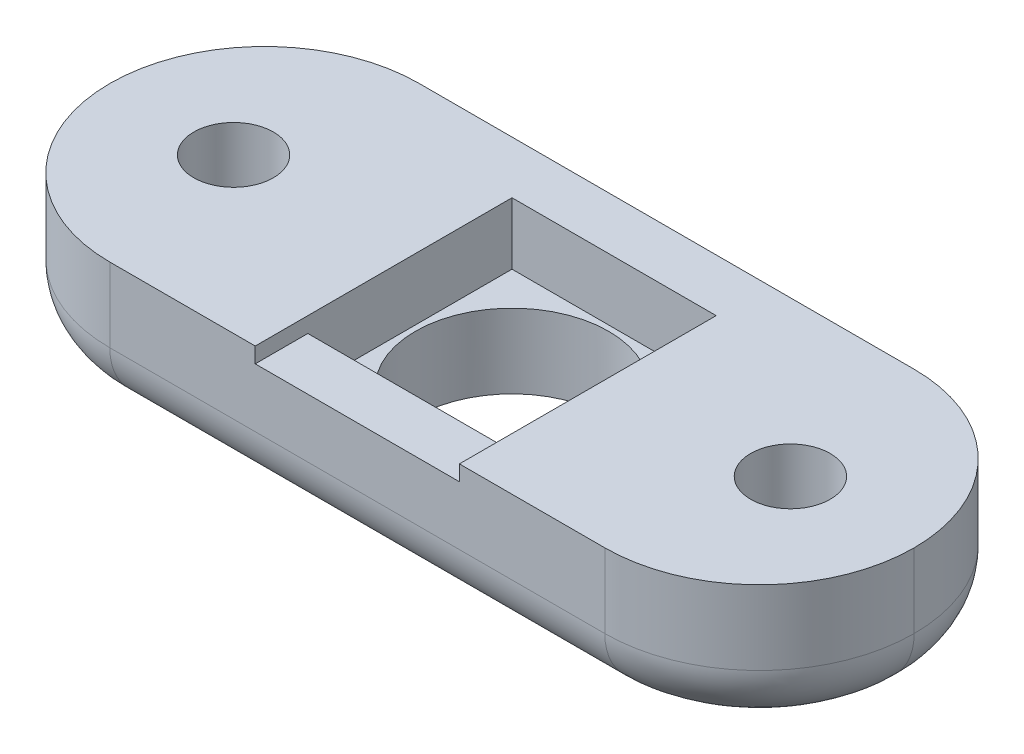
ISO-10303-21;
HEADER;
FILE_DESCRIPTION(('STEP AP214'),'2;1');
FILE_NAME('part.step','',(''),(''),'','','');
FILE_SCHEMA(('AUTOMOTIVE_DESIGN { 1 0 10303 214 1 1 1 1 }'));
ENDSEC;
DATA;
#1=APPLICATION_CONTEXT('core data for automotive mechanical design processes');
#2=APPLICATION_PROTOCOL_DEFINITION('international standard','automotive_design',2000,#1);
#3=PRODUCT_CONTEXT('',#1,'mechanical');
#4=PRODUCT('Part','Part','',(#3));
#5=PRODUCT_RELATED_PRODUCT_CATEGORY('part','',(#4));
#6=PRODUCT_DEFINITION_FORMATION('','',#4);
#7=PRODUCT_DEFINITION_CONTEXT('part definition',#1,'design');
#8=PRODUCT_DEFINITION('design','',#6,#7);
#9=PRODUCT_DEFINITION_SHAPE('','',#8);
#10=(LENGTH_UNIT() NAMED_UNIT(*) SI_UNIT(.MILLI.,.METRE.));
#11=(NAMED_UNIT(*) PLANE_ANGLE_UNIT() SI_UNIT($,.RADIAN.));
#12=(NAMED_UNIT(*) SI_UNIT($,.STERADIAN.) SOLID_ANGLE_UNIT());
#13=UNCERTAINTY_MEASURE_WITH_UNIT(LENGTH_MEASURE(1.E-05),#10,'distance_accuracy_value','');
#14=(GEOMETRIC_REPRESENTATION_CONTEXT(3) GLOBAL_UNCERTAINTY_ASSIGNED_CONTEXT((#13)) GLOBAL_UNIT_ASSIGNED_CONTEXT((#10,
#11,#12)) REPRESENTATION_CONTEXT('',''));
#15=CARTESIAN_POINT('',(0.,0.,0.));
#16=DIRECTION('',(0.,0.,1.));
#17=DIRECTION('',(1.,0.,0.));
#18=AXIS2_PLACEMENT_3D('',#15,#16,#17);
#19=CARTESIAN_POINT('',(0.,0.,0.));
#20=DIRECTION('',(0.,-1.,0.));
#21=DIRECTION('',(0.,0.,-1.));
#22=AXIS2_PLACEMENT_3D('',#19,#20,#21);
#23=PLANE('',#22);
#24=CARTESIAN_POINT('',(-5.18594813304628,0.,-4.34912879852682));
#25=DIRECTION('',(0.,-1.,0.));
#26=DIRECTION('',(0.,0.,-1.));
#27=AXIS2_PLACEMENT_3D('',#24,#25,#26);
#28=CIRCLE('',#27,3.81);
#29=CARTESIAN_POINT('',(-1.37594813304627,0.,-4.34912879852681));
#30=VERTEX_POINT('',#29);
#31=CARTESIAN_POINT('',(-5.18594813304627,0.,-0.53912879852682));
#32=VERTEX_POINT('',#31);
#33=EDGE_CURVE('E250',#30,#32,#28,.T.);
#34=ORIENTED_EDGE('',*,*,#33,.T.);
#35=DIRECTION('',(1.,0.,0.));
#36=VECTOR('',#35,1.);
#37=CARTESIAN_POINT('',(-25.5059481330463,0.,-0.539128798526818));
#38=LINE('',#37,#36);
#39=CARTESIAN_POINT('',(-14.2346981330463,0.,-0.539128798526819));
#40=VERTEX_POINT('',#39);
#41=EDGE_CURVE('E252',#32,#40,#38,.F.);
#42=ORIENTED_EDGE('',*,*,#41,.T.);
#43=CARTESIAN_POINT('',(-15.3459481330463,0.,-4.34912879852682));
#44=DIRECTION('',(0.,1.,0.));
#45=DIRECTION('',(0.,0.,1.));
#46=AXIS2_PLACEMENT_3D('',#43,#44,#45);
#47=CIRCLE('',#46,3.96875);
#48=CARTESIAN_POINT('',(-14.2346981330463,0.,-8.15912879852682));
#49=VERTEX_POINT('',#48);
#50=EDGE_CURVE('E189',#40,#49,#47,.T.);
#51=ORIENTED_EDGE('',*,*,#50,.T.);
#52=DIRECTION('',(-1.,0.,0.));
#53=VECTOR('',#52,1.);
#54=CARTESIAN_POINT('',(-5.18594813304627,0.,-8.15912879852682));
#55=LINE('',#54,#53);
#56=CARTESIAN_POINT('',(-5.18594813304627,0.,-8.15912879852682));
#57=VERTEX_POINT('',#56);
#58=EDGE_CURVE('E246',#49,#57,#55,.F.);
#59=ORIENTED_EDGE('',*,*,#58,.T.);
#60=CARTESIAN_POINT('',(-5.18594813304627,0.,-4.34912879852682));
#61=DIRECTION('',(0.,-1.,0.));
#62=DIRECTION('',(0.,0.,-1.));
#63=AXIS2_PLACEMENT_3D('',#60,#61,#62);
#64=CIRCLE('',#63,3.81);
#65=EDGE_CURVE('E248',#57,#30,#64,.T.);
#66=ORIENTED_EDGE('',*,*,#65,.T.);
#67=CARTESIAN_POINT('',(-3.91594813304627,0.,-4.34912879852681));
#68=DIRECTION('',(0.,-1.,0.));
#69=DIRECTION('',(0.,0.,-1.));
#70=AXIS2_PLACEMENT_3D('',#67,#68,#69);
#71=CIRCLE('',#70,2.54);
#72=EDGE_CURVE('E236',#30,#30,#71,.T.);
#73=ORIENTED_EDGE('',*,*,#72,.F.);
#74=EDGE_LOOP('',(#34,#42,#51,#59,#66,#73));
#75=FACE_BOUND('',#74,.T.);
#76=ADVANCED_FACE('F34',(#75),#23,.T.);
#77=CARTESIAN_POINT('',(-26.7759481330463,0.,-4.34912879852682));
#78=DIRECTION('',(0.,-1.,0.));
#79=DIRECTION('',(0.,0.,-1.));
#80=AXIS2_PLACEMENT_3D('',#77,#78,#79);
#81=CYLINDRICAL_SURFACE('',#80,1.63195);
#82=CARTESIAN_POINT('',(-26.7759481330463,5.588,-4.34912879852682));
#83=DIRECTION('',(0.,-1.,0.));
#84=DIRECTION('',(0.,0.,-1.));
#85=AXIS2_PLACEMENT_3D('',#82,#83,#84);
#86=CIRCLE('',#85,1.63195);
#87=CARTESIAN_POINT('',(-26.7759481330463,5.588,-5.98107879852681));
#88=VERTEX_POINT('',#87);
#89=EDGE_CURVE('E358',#88,#88,#86,.T.);
#90=ORIENTED_EDGE('',*,*,#89,.F.);
#91=EDGE_LOOP('',(#90));
#92=FACE_BOUND('',#91,.T.);
#93=CARTESIAN_POINT('',(-26.7759481330463,3.175,-4.34912879852682));
#94=DIRECTION('',(0.,-1.,0.));
#95=DIRECTION('',(0.,0.,-1.));
#96=AXIS2_PLACEMENT_3D('',#93,#94,#95);
#97=CIRCLE('',#96,1.63195);
#98=CARTESIAN_POINT('',(-26.7759481330463,3.175,-5.98107879852681));
#99=VERTEX_POINT('',#98);
#100=EDGE_CURVE('E233',#99,#99,#97,.F.);
#101=ORIENTED_EDGE('',*,*,#100,.F.);
#102=EDGE_LOOP('',(#101));
#103=FACE_BOUND('',#102,.T.);
#104=ADVANCED_FACE('F293',(#92,#103),#81,.F.);
#105=CARTESIAN_POINT('',(-3.91594813304627,0.,-4.34912879852681));
#106=DIRECTION('',(0.,-1.,0.));
#107=DIRECTION('',(0.,0.,-1.));
#108=AXIS2_PLACEMENT_3D('',#105,#106,#107);
#109=CYLINDRICAL_SURFACE('',#108,1.63195);
#110=CARTESIAN_POINT('',(-3.91594813304627,5.588,-4.34912879852681));
#111=DIRECTION('',(0.,-1.,0.));
#112=DIRECTION('',(0.,0.,-1.));
#113=AXIS2_PLACEMENT_3D('',#110,#111,#112);
#114=CIRCLE('',#113,1.63195);
#115=CARTESIAN_POINT('',(-3.91594813304627,5.588,-5.98107879852681));
#116=VERTEX_POINT('',#115);
#117=EDGE_CURVE('E225',#116,#116,#114,.T.);
#118=ORIENTED_EDGE('',*,*,#117,.F.);
#119=EDGE_LOOP('',(#118));
#120=FACE_BOUND('',#119,.T.);
#121=CARTESIAN_POINT('',(-3.91594813304627,3.175,-4.34912879852681));
#122=DIRECTION('',(0.,-1.,0.));
#123=DIRECTION('',(0.,0.,-1.));
#124=AXIS2_PLACEMENT_3D('',#121,#122,#123);
#125=CIRCLE('',#124,1.63195);
#126=CARTESIAN_POINT('',(-3.91594813304627,3.175,-5.98107879852681));
#127=VERTEX_POINT('',#126);
#128=EDGE_CURVE('E229',#127,#127,#125,.F.);
#129=ORIENTED_EDGE('',*,*,#128,.F.);
#130=EDGE_LOOP('',(#129));
#131=FACE_BOUND('',#130,.T.);
#132=ADVANCED_FACE('F300',(#120,#131),#109,.F.);
#133=CARTESIAN_POINT('',(0.,5.588,0.));
#134=DIRECTION('',(0.,-1.,0.));
#135=DIRECTION('',(0.,0.,-1.));
#136=AXIS2_PLACEMENT_3D('',#133,#134,#135);
#137=PLANE('',#136);
#138=ORIENTED_EDGE('',*,*,#117,.T.);
#139=EDGE_LOOP('',(#138));
#140=FACE_BOUND('',#139,.T.);
#141=ORIENTED_EDGE('',*,*,#89,.T.);
#142=EDGE_LOOP('',(#141));
#143=FACE_BOUND('',#142,.T.);
#144=DIRECTION('',(0.,0.,-1.));
#145=VECTOR('',#144,1.);
#146=CARTESIAN_POINT('',(-11.1549481330463,5.588,-8.54012879852682));
#147=LINE('',#146,#145);
#148=CARTESIAN_POINT('',(-11.1549481330463,5.588,2.00087120147318));
#149=VERTEX_POINT('',#148);
#150=CARTESIAN_POINT('',(-11.1549481330463,5.588,-8.54012879852682));
#151=VERTEX_POINT('',#150);
#152=EDGE_CURVE('E369',#149,#151,#147,.T.);
#153=ORIENTED_EDGE('',*,*,#152,.F.);
#154=DIRECTION('',(1.,0.,0.));
#155=VECTOR('',#154,1.);
#156=CARTESIAN_POINT('',(1.16405186695372,5.588,2.00087120147318));
#157=LINE('',#156,#155);
#158=CARTESIAN_POINT('',(-5.18594813304627,5.588,2.00087120147318));
#159=VERTEX_POINT('',#158);
#160=EDGE_CURVE('E192',#149,#159,#157,.T.);
#161=ORIENTED_EDGE('',*,*,#160,.T.);
#162=CARTESIAN_POINT('',(-5.18594813304628,5.588,-4.34912879852682));
#163=DIRECTION('',(0.,-1.,0.));
#164=DIRECTION('',(0.,0.,-1.));
#165=AXIS2_PLACEMENT_3D('',#162,#163,#164);
#166=CIRCLE('',#165,6.35);
#167=CARTESIAN_POINT('',(1.16405186695372,5.588,-4.34912879852682));
#168=VERTEX_POINT('',#167);
#169=EDGE_CURVE('E209',#159,#168,#166,.F.);
#170=ORIENTED_EDGE('',*,*,#169,.T.);
#171=CARTESIAN_POINT('',(-5.18594813304627,5.588,-4.34912879852682));
#172=DIRECTION('',(0.,-1.,0.));
#173=DIRECTION('',(0.,0.,-1.));
#174=AXIS2_PLACEMENT_3D('',#171,#172,#173);
#175=CIRCLE('',#174,6.35);
#176=CARTESIAN_POINT('',(-5.18594813304627,5.588,-10.6991287985268));
#177=VERTEX_POINT('',#176);
#178=EDGE_CURVE('E211',#168,#177,#175,.F.);
#179=ORIENTED_EDGE('',*,*,#178,.T.);
#180=DIRECTION('',(-1.,0.,0.));
#181=VECTOR('',#180,1.);
#182=CARTESIAN_POINT('',(1.16405186695372,5.588,-10.6991287985268));
#183=LINE('',#182,#181);
#184=CARTESIAN_POINT('',(-25.5059481330463,5.588,-10.6991287985268));
#185=VERTEX_POINT('',#184);
#186=EDGE_CURVE('E197',#177,#185,#183,.T.);
#187=ORIENTED_EDGE('',*,*,#186,.T.);
#188=CARTESIAN_POINT('',(-25.5059481330463,5.588,-4.34912879852682));
#189=DIRECTION('',(0.,-1.,0.));
#190=DIRECTION('',(0.,0.,-1.));
#191=AXIS2_PLACEMENT_3D('',#188,#189,#190);
#192=CIRCLE('',#191,6.35);
#193=CARTESIAN_POINT('',(-31.8559481330463,5.588,-4.34912879852682));
#194=VERTEX_POINT('',#193);
#195=EDGE_CURVE('E213',#185,#194,#192,.F.);
#196=ORIENTED_EDGE('',*,*,#195,.T.);
#197=CARTESIAN_POINT('',(-25.5059481330463,5.588,-4.34912879852682));
#198=DIRECTION('',(0.,-1.,0.));
#199=DIRECTION('',(0.,0.,-1.));
#200=AXIS2_PLACEMENT_3D('',#197,#198,#199);
#201=CIRCLE('',#200,6.35);
#202=CARTESIAN_POINT('',(-25.5059481330463,5.588,2.00087120147318));
#203=VERTEX_POINT('',#202);
#204=EDGE_CURVE('E215',#194,#203,#201,.F.);
#205=ORIENTED_EDGE('',*,*,#204,.T.);
#206=CARTESIAN_POINT('',(-19.5369481330463,5.588,2.00087120147318));
#207=VERTEX_POINT('',#206);
#208=EDGE_CURVE('E194',#203,#207,#157,.T.);
#209=ORIENTED_EDGE('',*,*,#208,.T.);
#210=DIRECTION('',(0.,0.,1.));
#211=VECTOR('',#210,1.);
#212=CARTESIAN_POINT('',(-19.5369481330463,5.588,-8.54012879852682));
#213=LINE('',#212,#211);
#214=CARTESIAN_POINT('',(-19.5369481330463,5.588,-8.54012879852682));
#215=VERTEX_POINT('',#214);
#216=EDGE_CURVE('E361',#215,#207,#213,.T.);
#217=ORIENTED_EDGE('',*,*,#216,.F.);
#218=DIRECTION('',(-1.,0.,0.));
#219=VECTOR('',#218,1.);
#220=CARTESIAN_POINT('',(-11.1549481330463,5.588,-8.54012879852682));
#221=LINE('',#220,#219);
#222=EDGE_CURVE('E364',#151,#215,#221,.T.);
#223=ORIENTED_EDGE('',*,*,#222,.F.);
#224=EDGE_LOOP('',(#153,#161,#170,#179,#187,#196,#205,#209,#217,#223));
#225=FACE_BOUND('',#224,.T.);
#226=ADVANCED_FACE('F306',(#140,#143,#225),#137,.F.);
#227=CARTESIAN_POINT('',(-16.4571981330463,0.,-8.15912879852682));
#228=VERTEX_POINT('',#227);
#229=CARTESIAN_POINT('',(-16.4571981330463,0.,-0.539128798526819));
#230=VERTEX_POINT('',#229);
#231=EDGE_CURVE('E193',#228,#230,#47,.T.);
#232=ORIENTED_EDGE('',*,*,#231,.T.);
#233=DIRECTION('',(1.,0.,0.));
#234=VECTOR('',#233,1.);
#235=CARTESIAN_POINT('',(-25.5059481330463,0.,-0.539128798526818));
#236=LINE('',#235,#234);
#237=CARTESIAN_POINT('',(-25.5059481330463,0.,-0.539128798526817));
#238=VERTEX_POINT('',#237);
#239=EDGE_CURVE('E244',#230,#238,#236,.F.);
#240=ORIENTED_EDGE('',*,*,#239,.T.);
#241=CARTESIAN_POINT('',(-25.5059481330463,0.,-4.34912879852682));
#242=DIRECTION('',(0.,-1.,0.));
#243=DIRECTION('',(0.,0.,-1.));
#244=AXIS2_PLACEMENT_3D('',#241,#242,#243);
#245=CIRCLE('',#244,3.81);
#246=CARTESIAN_POINT('',(-29.3159481330463,0.,-4.34912879852682));
#247=VERTEX_POINT('',#246);
#248=EDGE_CURVE('E241',#238,#247,#245,.T.);
#249=ORIENTED_EDGE('',*,*,#248,.T.);
#250=CARTESIAN_POINT('',(-26.7759481330463,0.,-4.34912879852682));
#251=DIRECTION('',(0.,-1.,0.));
#252=DIRECTION('',(0.,0.,-1.));
#253=AXIS2_PLACEMENT_3D('',#250,#251,#252);
#254=CIRCLE('',#253,2.54);
#255=EDGE_CURVE('E340',#247,#247,#254,.T.);
#256=ORIENTED_EDGE('',*,*,#255,.F.);
#257=CARTESIAN_POINT('',(-25.5059481330463,0.,-4.34912879852682));
#258=DIRECTION('',(0.,-1.,0.));
#259=DIRECTION('',(0.,0.,-1.));
#260=AXIS2_PLACEMENT_3D('',#257,#258,#259);
#261=CIRCLE('',#260,3.81);
#262=CARTESIAN_POINT('',(-25.5059481330463,0.,-8.15912879852682));
#263=VERTEX_POINT('',#262);
#264=EDGE_CURVE('E221',#247,#263,#261,.T.);
#265=ORIENTED_EDGE('',*,*,#264,.T.);
#266=DIRECTION('',(-1.,0.,0.));
#267=VECTOR('',#266,1.);
#268=CARTESIAN_POINT('',(-5.18594813304627,0.,-8.15912879852682));
#269=LINE('',#268,#267);
#270=EDGE_CURVE('E239',#263,#228,#269,.F.);
#271=ORIENTED_EDGE('',*,*,#270,.T.);
#272=EDGE_LOOP('',(#232,#240,#249,#256,#265,#271));
#273=FACE_BOUND('',#272,.T.);
#274=ADVANCED_FACE('F296',(#273),#23,.T.);
#275=CARTESIAN_POINT('',(1.16405186695372,5.588,2.00087120147318));
#276=DIRECTION('',(0.,0.,-1.));
#277=DIRECTION('',(-1.,0.,0.));
#278=AXIS2_PLACEMENT_3D('',#275,#276,#277);
#279=PLANE('',#278);
#280=DIRECTION('',(0.,-1.,0.));
#281=VECTOR('',#280,1.);
#282=CARTESIAN_POINT('',(-25.5059481330463,5.588,2.00087120147318));
#283=LINE('',#282,#281);
#284=CARTESIAN_POINT('',(-25.5059481330463,2.54,2.00087120147318));
#285=VERTEX_POINT('',#284);
#286=EDGE_CURVE('E206',#203,#285,#283,.T.);
#287=ORIENTED_EDGE('',*,*,#286,.T.);
#288=DIRECTION('',(1.,0.,0.));
#289=VECTOR('',#288,1.);
#290=CARTESIAN_POINT('',(-5.18594813304627,2.54,2.00087120147318));
#291=LINE('',#290,#289);
#292=CARTESIAN_POINT('',(-5.18594813304627,2.54,2.00087120147318));
#293=VERTEX_POINT('',#292);
#294=EDGE_CURVE('E257',#285,#293,#291,.T.);
#295=ORIENTED_EDGE('',*,*,#294,.T.);
#296=DIRECTION('',(0.,-1.,0.));
#297=VECTOR('',#296,1.);
#298=CARTESIAN_POINT('',(-5.18594813304627,5.588,2.00087120147318));
#299=LINE('',#298,#297);
#300=EDGE_CURVE('E200',#293,#159,#299,.F.);
#301=ORIENTED_EDGE('',*,*,#300,.T.);
#302=ORIENTED_EDGE('',*,*,#160,.F.);
#303=DIRECTION('',(0.,1.,0.));
#304=VECTOR('',#303,1.);
#305=CARTESIAN_POINT('',(-11.1549481330463,4.953,2.00087120147318));
#306=LINE('',#305,#304);
#307=CARTESIAN_POINT('',(-11.1549481330463,4.953,2.00087120147318));
#308=VERTEX_POINT('',#307);
#309=EDGE_CURVE('E228',#308,#149,#306,.T.);
#310=ORIENTED_EDGE('',*,*,#309,.F.);
#311=DIRECTION('',(1.,0.,0.));
#312=VECTOR('',#311,1.);
#313=CARTESIAN_POINT('',(-11.1549481330463,4.953,2.00087120147318));
#314=LINE('',#313,#312);
#315=CARTESIAN_POINT('',(-19.5369481330463,4.953,2.00087120147318));
#316=VERTEX_POINT('',#315);
#317=EDGE_CURVE('E166',#316,#308,#314,.T.);
#318=ORIENTED_EDGE('',*,*,#317,.F.);
#319=DIRECTION('',(0.,1.,0.));
#320=VECTOR('',#319,1.);
#321=CARTESIAN_POINT('',(-19.5369481330463,4.953,2.00087120147318));
#322=LINE('',#321,#320);
#323=EDGE_CURVE('E162',#316,#207,#322,.T.);
#324=ORIENTED_EDGE('',*,*,#323,.T.);
#325=ORIENTED_EDGE('',*,*,#208,.F.);
#326=EDGE_LOOP('',(#287,#295,#301,#302,#310,#318,#324,#325));
#327=FACE_BOUND('',#326,.T.);
#328=ADVANCED_FACE('F305',(#327),#279,.F.);
#329=CARTESIAN_POINT('',(1.16405186695372,5.588,-10.6991287985268));
#330=DIRECTION('',(0.,0.,1.));
#331=DIRECTION('',(1.,0.,0.));
#332=AXIS2_PLACEMENT_3D('',#329,#330,#331);
#333=PLANE('',#332);
#334=DIRECTION('',(0.,-1.,0.));
#335=VECTOR('',#334,1.);
#336=CARTESIAN_POINT('',(-5.18594813304627,5.588,-10.6991287985268));
#337=LINE('',#336,#335);
#338=CARTESIAN_POINT('',(-5.18594813304627,2.54,-10.6991287985268));
#339=VERTEX_POINT('',#338);
#340=EDGE_CURVE('E217',#177,#339,#337,.T.);
#341=ORIENTED_EDGE('',*,*,#340,.T.);
#342=DIRECTION('',(-1.,0.,0.));
#343=VECTOR('',#342,1.);
#344=CARTESIAN_POINT('',(-25.5059481330463,2.54,-10.6991287985268));
#345=LINE('',#344,#343);
#346=CARTESIAN_POINT('',(-25.5059481330463,2.54,-10.6991287985268));
#347=VERTEX_POINT('',#346);
#348=EDGE_CURVE('E43',#339,#347,#345,.T.);
#349=ORIENTED_EDGE('',*,*,#348,.T.);
#350=DIRECTION('',(0.,-1.,0.));
#351=VECTOR('',#350,1.);
#352=CARTESIAN_POINT('',(-25.5059481330463,5.588,-10.6991287985268));
#353=LINE('',#352,#351);
#354=EDGE_CURVE('E219',#347,#185,#353,.F.);
#355=ORIENTED_EDGE('',*,*,#354,.T.);
#356=ORIENTED_EDGE('',*,*,#186,.F.);
#357=EDGE_LOOP('',(#341,#349,#355,#356));
#358=FACE_BOUND('',#357,.T.);
#359=ADVANCED_FACE('F312',(#358),#333,.F.);
#360=CARTESIAN_POINT('',(-15.3459481330463,5.588,-4.34912879852682));
#361=DIRECTION('',(0.,-1.,0.));
#362=DIRECTION('',(0.,0.,-1.));
#363=AXIS2_PLACEMENT_3D('',#360,#361,#362);
#364=CYLINDRICAL_SURFACE('',#363,3.96875);
#365=CARTESIAN_POINT('',(-15.3459481330463,3.048,-4.34912879852682));
#366=DIRECTION('',(0.,-1.,0.));
#367=DIRECTION('',(0.,0.,-1.));
#368=AXIS2_PLACEMENT_3D('',#365,#366,#367);
#369=CIRCLE('',#368,3.96875);
#370=CARTESIAN_POINT('',(-15.3459481330463,3.048,-8.31787879852682));
#371=VERTEX_POINT('',#370);
#372=EDGE_CURVE('E201',#371,#371,#369,.T.);
#373=ORIENTED_EDGE('',*,*,#372,.F.);
#374=EDGE_LOOP('',(#373));
#375=FACE_BOUND('',#374,.T.);
#376=ORIENTED_EDGE('',*,*,#50,.F.);
#377=CARTESIAN_POINT('',(-14.2346981330463,0.,-0.539128798526819));
#378=CARTESIAN_POINT('',(-14.3392931740389,4.60604915866399E-05,-0.508611398834149));
#379=CARTESIAN_POINT('',(-14.4451450763377,0.000551800659845645,-0.482422010887287));
#380=CARTESIAN_POINT('',(-14.6586563596952,0.00187512242722543,-0.438827096057001));
#381=CARTESIAN_POINT('',(-14.7663159888434,0.00269274716889175,-0.421422785174851));
#382=CARTESIAN_POINT('',(-14.9802680305637,0.00401687567847526,-0.395826187957534));
#383=CARTESIAN_POINT('',(-15.086536551412,0.00452997767245198,-0.38743507553609));
#384=CARTESIAN_POINT('',(-15.2993619638375,0.00503555180767513,-0.379222958807811));
#385=CARTESIAN_POINT('',(-15.4059187805202,0.00502814820242356,-0.379399909156143));
#386=CARTESIAN_POINT('',(-15.6707866582981,0.00433507158474852,-0.390521284922752));
#387=CARTESIAN_POINT('',(-15.8289209451164,0.00331943601041202,-0.406689627447391));
#388=CARTESIAN_POINT('',(-16.0650534718032,0.00170618632145947,-0.445234500049051));
#389=CARTESIAN_POINT('',(-16.1442591140336,0.00114829917393376,-0.460660163178343));
#390=CARTESIAN_POINT('',(-16.3015972686432,0.000299803684776872,-0.496310063060891));
#391=CARTESIAN_POINT('',(-16.3797296128841,9.23676046668937E-06,-0.516535042786955));
#392=CARTESIAN_POINT('',(-16.4571981330463,0.,-0.53912879852682));
#393=B_SPLINE_CURVE_WITH_KNOTS('',3,(#377,#378,#379,#380,#381,#382,#383,#384,#385,#386,#387,
#388,#389,#390,#391,#392),.UNSPECIFIED.,.F.,.F.,(4,2,2,2,2,2,2,4),(0.,0.326767419494472,
0.653580056658502,0.973025199141419,1.29239408491758,1.76796252161595,2.00992423099308,
2.25192342245369),.UNSPECIFIED.);
#394=EDGE_CURVE('E266',#40,#230,#393,.T.);
#395=ORIENTED_EDGE('',*,*,#394,.T.);
#396=ORIENTED_EDGE('',*,*,#231,.F.);
#397=CARTESIAN_POINT('',(-16.4571981330463,0.,-8.15912879852682));
#398=CARTESIAN_POINT('',(-16.3526030920537,4.60604915872649E-05,-8.18964619821949));
#399=CARTESIAN_POINT('',(-16.2467511897548,0.000551800659846458,-8.21583558616635));
#400=CARTESIAN_POINT('',(-16.0332399063974,0.00187512242722614,-8.25943050099663));
#401=CARTESIAN_POINT('',(-15.9255802772491,0.00269274716889215,-8.27683481187879));
#402=CARTESIAN_POINT('',(-15.7116282355289,0.00401687567847504,-8.3024314090961));
#403=CARTESIAN_POINT('',(-15.6053597146806,0.00452997767245143,-8.31082252151754));
#404=CARTESIAN_POINT('',(-15.3925343022551,0.00503555180767438,-8.31903463824582));
#405=CARTESIAN_POINT('',(-15.2859774855724,0.00502814820242293,-8.31885768789749));
#406=CARTESIAN_POINT('',(-15.0211096077944,0.00433507158474832,-8.30773631213088));
#407=CARTESIAN_POINT('',(-14.8629753209762,0.00331943601041226,-8.29156796960624));
#408=CARTESIAN_POINT('',(-14.6268427942894,0.00170618632145965,-8.25302309700458));
#409=CARTESIAN_POINT('',(-14.547637152059,0.00114829917393381,-8.23759743387529));
#410=CARTESIAN_POINT('',(-14.3902989974494,0.000299803684776769,-8.20194753399274));
#411=CARTESIAN_POINT('',(-14.3121666532085,9.23676046656533E-06,-8.18172255426668));
#412=CARTESIAN_POINT('',(-14.2346981330463,0.,-8.15912879852682));
#413=B_SPLINE_CURVE_WITH_KNOTS('',3,(#397,#398,#399,#400,#401,#402,#403,#404,#405,#406,#407,
#408,#409,#410,#411,#412),.UNSPECIFIED.,.F.,.F.,(4,2,2,2,2,2,2,4),(0.,0.326767419494477,
0.653580056658503,0.973025199141418,1.29239408491759,1.76796252161594,2.00992423099305,
2.25192342245366),.UNSPECIFIED.);
#414=EDGE_CURVE('E259',#228,#49,#413,.T.);
#415=ORIENTED_EDGE('',*,*,#414,.T.);
#416=EDGE_LOOP('',(#376,#395,#396,#415));
#417=FACE_BOUND('',#416,.T.);
#418=ADVANCED_FACE('F272',(#375,#417),#364,.F.);
#419=CARTESIAN_POINT('',(-19.5369481330463,3.048,-8.54012879852682));
#420=DIRECTION('',(-1.,0.,0.));
#421=DIRECTION('',(0.,0.,1.));
#422=AXIS2_PLACEMENT_3D('',#419,#420,#421);
#423=PLANE('',#422);
#424=ORIENTED_EDGE('',*,*,#216,.T.);
#425=ORIENTED_EDGE('',*,*,#323,.F.);
#426=DIRECTION('',(0.,0.,1.));
#427=VECTOR('',#426,1.);
#428=CARTESIAN_POINT('',(-19.5369481330463,4.953,-0.158128798526816));
#429=LINE('',#428,#427);
#430=CARTESIAN_POINT('',(-19.5369481330463,4.953,-0.158128798526816));
#431=VERTEX_POINT('',#430);
#432=EDGE_CURVE('E154',#431,#316,#429,.T.);
#433=ORIENTED_EDGE('',*,*,#432,.F.);
#434=DIRECTION('',(0.,1.,0.));
#435=VECTOR('',#434,1.);
#436=CARTESIAN_POINT('',(-19.5369481330463,3.048,-0.158128798526815));
#437=LINE('',#436,#435);
#438=CARTESIAN_POINT('',(-19.5369481330463,3.048,-0.158128798526815));
#439=VERTEX_POINT('',#438);
#440=EDGE_CURVE('E159',#439,#431,#437,.T.);
#441=ORIENTED_EDGE('',*,*,#440,.F.);
#442=DIRECTION('',(0.,0.,1.));
#443=VECTOR('',#442,1.);
#444=CARTESIAN_POINT('',(-19.5369481330463,3.048,-8.54012879852682));
#445=LINE('',#444,#443);
#446=CARTESIAN_POINT('',(-19.5369481330463,3.048,-8.54012879852682));
#447=VERTEX_POINT('',#446);
#448=EDGE_CURVE('E362',#447,#439,#445,.T.);
#449=ORIENTED_EDGE('',*,*,#448,.F.);
#450=DIRECTION('',(0.,1.,0.));
#451=VECTOR('',#450,1.);
#452=CARTESIAN_POINT('',(-19.5369481330463,3.048,-8.54012879852682));
#453=LINE('',#452,#451);
#454=EDGE_CURVE('E204',#447,#215,#453,.T.);
#455=ORIENTED_EDGE('',*,*,#454,.T.);
#456=EDGE_LOOP('',(#424,#425,#433,#441,#449,#455));
#457=FACE_BOUND('',#456,.T.);
#458=ADVANCED_FACE('F156',(#457),#423,.F.);
#459=CARTESIAN_POINT('',(-11.1549481330463,3.048,-8.54012879852682));
#460=DIRECTION('',(0.,0.,-1.));
#461=DIRECTION('',(-1.,0.,0.));
#462=AXIS2_PLACEMENT_3D('',#459,#460,#461);
#463=PLANE('',#462);
#464=ORIENTED_EDGE('',*,*,#222,.T.);
#465=ORIENTED_EDGE('',*,*,#454,.F.);
#466=DIRECTION('',(-1.,0.,0.));
#467=VECTOR('',#466,1.);
#468=CARTESIAN_POINT('',(-11.1549481330463,3.048,-8.54012879852682));
#469=LINE('',#468,#467);
#470=CARTESIAN_POINT('',(-11.1549481330463,3.048,-8.54012879852682));
#471=VERTEX_POINT('',#470);
#472=EDGE_CURVE('E180',#471,#447,#469,.T.);
#473=ORIENTED_EDGE('',*,*,#472,.F.);
#474=DIRECTION('',(0.,1.,0.));
#475=VECTOR('',#474,1.);
#476=CARTESIAN_POINT('',(-11.1549481330463,3.048,-8.54012879852682));
#477=LINE('',#476,#475);
#478=EDGE_CURVE('E182',#471,#151,#477,.T.);
#479=ORIENTED_EDGE('',*,*,#478,.T.);
#480=EDGE_LOOP('',(#464,#465,#473,#479));
#481=FACE_BOUND('',#480,.T.);
#482=ADVANCED_FACE('F376',(#481),#463,.F.);
#483=CARTESIAN_POINT('',(-11.1549481330463,3.048,-8.54012879852682));
#484=DIRECTION('',(1.,0.,0.));
#485=DIRECTION('',(0.,0.,-1.));
#486=AXIS2_PLACEMENT_3D('',#483,#484,#485);
#487=PLANE('',#486);
#488=ORIENTED_EDGE('',*,*,#152,.T.);
#489=ORIENTED_EDGE('',*,*,#478,.F.);
#490=DIRECTION('',(0.,0.,-1.));
#491=VECTOR('',#490,1.);
#492=CARTESIAN_POINT('',(-11.1549481330463,3.048,-8.54012879852682));
#493=LINE('',#492,#491);
#494=CARTESIAN_POINT('',(-11.1549481330463,3.048,-0.158128798526816));
#495=VERTEX_POINT('',#494);
#496=EDGE_CURVE('E185',#495,#471,#493,.T.);
#497=ORIENTED_EDGE('',*,*,#496,.F.);
#498=DIRECTION('',(0.,1.,0.));
#499=VECTOR('',#498,1.);
#500=CARTESIAN_POINT('',(-11.1549481330463,3.048,-0.158128798526816));
#501=LINE('',#500,#499);
#502=CARTESIAN_POINT('',(-11.1549481330463,4.953,-0.158128798526816));
#503=VERTEX_POINT('',#502);
#504=EDGE_CURVE('E179',#495,#503,#501,.T.);
#505=ORIENTED_EDGE('',*,*,#504,.T.);
#506=DIRECTION('',(0.,0.,-1.));
#507=VECTOR('',#506,1.);
#508=CARTESIAN_POINT('',(-11.1549481330463,4.953,-0.158128798526816));
#509=LINE('',#508,#507);
#510=EDGE_CURVE('E171',#308,#503,#509,.T.);
#511=ORIENTED_EDGE('',*,*,#510,.F.);
#512=ORIENTED_EDGE('',*,*,#309,.T.);
#513=EDGE_LOOP('',(#488,#489,#497,#505,#511,#512));
#514=FACE_BOUND('',#513,.T.);
#515=ADVANCED_FACE('F381',(#514),#487,.F.);
#516=CARTESIAN_POINT('',(-11.1549481330463,3.048,-0.158128798526816));
#517=DIRECTION('',(0.,0.,1.));
#518=DIRECTION('',(1.,0.,0.));
#519=AXIS2_PLACEMENT_3D('',#516,#517,#518);
#520=PLANE('',#519);
#521=ORIENTED_EDGE('',*,*,#440,.T.);
#522=DIRECTION('',(-1.,0.,0.));
#523=VECTOR('',#522,1.);
#524=CARTESIAN_POINT('',(-11.1549481330463,4.953,-0.158128798526816));
#525=LINE('',#524,#523);
#526=EDGE_CURVE('E167',#503,#431,#525,.T.);
#527=ORIENTED_EDGE('',*,*,#526,.F.);
#528=ORIENTED_EDGE('',*,*,#504,.F.);
#529=DIRECTION('',(1.,0.,0.));
#530=VECTOR('',#529,1.);
#531=CARTESIAN_POINT('',(-11.1549481330463,3.048,-0.158128798526816));
#532=LINE('',#531,#530);
#533=EDGE_CURVE('E177',#439,#495,#532,.T.);
#534=ORIENTED_EDGE('',*,*,#533,.F.);
#535=EDGE_LOOP('',(#521,#527,#528,#534));
#536=FACE_BOUND('',#535,.T.);
#537=ADVANCED_FACE('F175',(#536),#520,.F.);
#538=CARTESIAN_POINT('',(0.,3.048,0.));
#539=DIRECTION('',(0.,-1.,0.));
#540=DIRECTION('',(0.,0.,-1.));
#541=AXIS2_PLACEMENT_3D('',#538,#539,#540);
#542=PLANE('',#541);
#543=ORIENTED_EDGE('',*,*,#372,.T.);
#544=EDGE_LOOP('',(#543));
#545=FACE_BOUND('',#544,.T.);
#546=ORIENTED_EDGE('',*,*,#448,.T.);
#547=ORIENTED_EDGE('',*,*,#533,.T.);
#548=ORIENTED_EDGE('',*,*,#496,.T.);
#549=ORIENTED_EDGE('',*,*,#472,.T.);
#550=EDGE_LOOP('',(#546,#547,#548,#549));
#551=FACE_BOUND('',#550,.T.);
#552=ADVANCED_FACE('F442',(#545,#551),#542,.F.);
#553=CARTESIAN_POINT('',(-25.5059481330463,5.588,-4.34912879852682));
#554=DIRECTION('',(0.,-1.,0.));
#555=DIRECTION('',(0.,0.,-1.));
#556=AXIS2_PLACEMENT_3D('',#553,#554,#555);
#557=CYLINDRICAL_SURFACE('',#556,6.35);
#558=ORIENTED_EDGE('',*,*,#354,.F.);
#559=CARTESIAN_POINT('',(-25.5059481330463,2.54,-4.34912879852682));
#560=DIRECTION('',(0.,-1.,0.));
#561=DIRECTION('',(0.,0.,-1.));
#562=AXIS2_PLACEMENT_3D('',#559,#560,#561);
#563=CIRCLE('',#562,6.35);
#564=CARTESIAN_POINT('',(-31.8559481330463,2.54,-4.34912879852682));
#565=VERTEX_POINT('',#564);
#566=EDGE_CURVE('E11',#347,#565,#563,.F.);
#567=ORIENTED_EDGE('',*,*,#566,.T.);
#568=DIRECTION('',(0.,-1.,0.));
#569=VECTOR('',#568,1.);
#570=CARTESIAN_POINT('',(-31.8559481330463,5.588,-4.34912879852682));
#571=LINE('',#570,#569);
#572=EDGE_CURVE('E222',#194,#565,#571,.T.);
#573=ORIENTED_EDGE('',*,*,#572,.F.);
#574=ORIENTED_EDGE('',*,*,#195,.F.);
#575=EDGE_LOOP('',(#558,#567,#573,#574));
#576=FACE_BOUND('',#575,.T.);
#577=ADVANCED_FACE('F402',(#576),#557,.T.);
#578=CARTESIAN_POINT('',(-25.5059481330463,5.588,-4.34912879852682));
#579=DIRECTION('',(0.,-1.,0.));
#580=DIRECTION('',(0.,0.,-1.));
#581=AXIS2_PLACEMENT_3D('',#578,#579,#580);
#582=CYLINDRICAL_SURFACE('',#581,6.35);
#583=ORIENTED_EDGE('',*,*,#572,.T.);
#584=CARTESIAN_POINT('',(-25.5059481330463,2.54,-4.34912879852682));
#585=DIRECTION('',(0.,-1.,0.));
#586=DIRECTION('',(0.,0.,-1.));
#587=AXIS2_PLACEMENT_3D('',#584,#585,#586);
#588=CIRCLE('',#587,6.35);
#589=EDGE_CURVE('E254',#565,#285,#588,.F.);
#590=ORIENTED_EDGE('',*,*,#589,.T.);
#591=ORIENTED_EDGE('',*,*,#286,.F.);
#592=ORIENTED_EDGE('',*,*,#204,.F.);
#593=EDGE_LOOP('',(#583,#590,#591,#592));
#594=FACE_BOUND('',#593,.T.);
#595=ADVANCED_FACE('F467',(#594),#582,.T.);
#596=CARTESIAN_POINT('',(-5.18594813304628,5.588,-4.34912879852682));
#597=DIRECTION('',(0.,-1.,0.));
#598=DIRECTION('',(0.,0.,-1.));
#599=AXIS2_PLACEMENT_3D('',#596,#597,#598);
#600=CYLINDRICAL_SURFACE('',#599,6.35);
#601=ORIENTED_EDGE('',*,*,#300,.F.);
#602=CARTESIAN_POINT('',(-5.18594813304628,2.54,-4.34912879852682));
#603=DIRECTION('',(0.,-1.,0.));
#604=DIRECTION('',(0.,0.,-1.));
#605=AXIS2_PLACEMENT_3D('',#602,#603,#604);
#606=CIRCLE('',#605,6.35);
#607=CARTESIAN_POINT('',(1.16405186695372,2.54,-4.34912879852682));
#608=VERTEX_POINT('',#607);
#609=EDGE_CURVE('E395',#293,#608,#606,.F.);
#610=ORIENTED_EDGE('',*,*,#609,.T.);
#611=DIRECTION('',(0.,-1.,0.));
#612=VECTOR('',#611,1.);
#613=CARTESIAN_POINT('',(1.16405186695372,5.588,-4.34912879852682));
#614=LINE('',#613,#612);
#615=EDGE_CURVE('E226',#168,#608,#614,.T.);
#616=ORIENTED_EDGE('',*,*,#615,.F.);
#617=ORIENTED_EDGE('',*,*,#169,.F.);
#618=EDGE_LOOP('',(#601,#610,#616,#617));
#619=FACE_BOUND('',#618,.T.);
#620=ADVANCED_FACE('F392',(#619),#600,.T.);
#621=CARTESIAN_POINT('',(-5.18594813304627,5.588,-4.34912879852682));
#622=DIRECTION('',(0.,-1.,0.));
#623=DIRECTION('',(0.,0.,-1.));
#624=AXIS2_PLACEMENT_3D('',#621,#622,#623);
#625=CYLINDRICAL_SURFACE('',#624,6.35);
#626=ORIENTED_EDGE('',*,*,#615,.T.);
#627=CARTESIAN_POINT('',(-5.18594813304627,2.54,-4.34912879852682));
#628=DIRECTION('',(0.,-1.,0.));
#629=DIRECTION('',(0.,0.,-1.));
#630=AXIS2_PLACEMENT_3D('',#627,#628,#629);
#631=CIRCLE('',#630,6.35);
#632=EDGE_CURVE('E58',#608,#339,#631,.F.);
#633=ORIENTED_EDGE('',*,*,#632,.T.);
#634=ORIENTED_EDGE('',*,*,#340,.F.);
#635=ORIENTED_EDGE('',*,*,#178,.F.);
#636=EDGE_LOOP('',(#626,#633,#634,#635));
#637=FACE_BOUND('',#636,.T.);
#638=ADVANCED_FACE('F396',(#637),#625,.T.);
#639=CARTESIAN_POINT('',(0.,4.953,0.));
#640=DIRECTION('',(0.,-1.,0.));
#641=DIRECTION('',(0.,0.,-1.));
#642=AXIS2_PLACEMENT_3D('',#639,#640,#641);
#643=PLANE('',#642);
#644=ORIENTED_EDGE('',*,*,#510,.T.);
#645=ORIENTED_EDGE('',*,*,#526,.T.);
#646=ORIENTED_EDGE('',*,*,#432,.T.);
#647=ORIENTED_EDGE('',*,*,#317,.T.);
#648=EDGE_LOOP('',(#644,#645,#646,#647));
#649=FACE_BOUND('',#648,.T.);
#650=ADVANCED_FACE('F170',(#649),#643,.F.);
#651=CARTESIAN_POINT('',(-3.91594813304627,3.175,-4.34912879852681));
#652=DIRECTION('',(0.,-1.,0.));
#653=DIRECTION('',(0.,0.,-1.));
#654=AXIS2_PLACEMENT_3D('',#651,#652,#653);
#655=PLANE('',#654);
#656=CARTESIAN_POINT('',(-3.91594813304627,3.175,-4.34912879852681));
#657=DIRECTION('',(0.,-1.,0.));
#658=DIRECTION('',(0.,0.,-1.));
#659=AXIS2_PLACEMENT_3D('',#656,#657,#658);
#660=CIRCLE('',#659,2.54);
#661=CARTESIAN_POINT('',(-3.91594813304627,3.175,-6.88912879852681));
#662=VERTEX_POINT('',#661);
#663=EDGE_CURVE('E232',#662,#662,#660,.T.);
#664=ORIENTED_EDGE('',*,*,#663,.T.);
#665=EDGE_LOOP('',(#664));
#666=FACE_BOUND('',#665,.T.);
#667=ORIENTED_EDGE('',*,*,#128,.T.);
#668=EDGE_LOOP('',(#667));
#669=FACE_BOUND('',#668,.T.);
#670=ADVANCED_FACE('F423',(#666,#669),#655,.T.);
#671=CARTESIAN_POINT('',(-3.91594813304627,3.175,-4.34912879852681));
#672=DIRECTION('',(0.,-1.,0.));
#673=DIRECTION('',(0.,0.,-1.));
#674=AXIS2_PLACEMENT_3D('',#671,#672,#673);
#675=CYLINDRICAL_SURFACE('',#674,2.54);
#676=ORIENTED_EDGE('',*,*,#663,.F.);
#677=EDGE_LOOP('',(#676));
#678=FACE_BOUND('',#677,.T.);
#679=ORIENTED_EDGE('',*,*,#72,.T.);
#680=EDGE_LOOP('',(#679));
#681=FACE_BOUND('',#680,.T.);
#682=ADVANCED_FACE('F420',(#678,#681),#675,.F.);
#683=CARTESIAN_POINT('',(-26.7759481330463,3.175,-4.34912879852682));
#684=DIRECTION('',(0.,-1.,0.));
#685=DIRECTION('',(0.,0.,-1.));
#686=AXIS2_PLACEMENT_3D('',#683,#684,#685);
#687=PLANE('',#686);
#688=CARTESIAN_POINT('',(-26.7759481330463,3.175,-4.34912879852682));
#689=DIRECTION('',(0.,-1.,0.));
#690=DIRECTION('',(0.,0.,-1.));
#691=AXIS2_PLACEMENT_3D('',#688,#689,#690);
#692=CIRCLE('',#691,2.54);
#693=CARTESIAN_POINT('',(-26.7759481330463,3.175,-6.88912879852682));
#694=VERTEX_POINT('',#693);
#695=EDGE_CURVE('E237',#694,#694,#692,.T.);
#696=ORIENTED_EDGE('',*,*,#695,.T.);
#697=EDGE_LOOP('',(#696));
#698=FACE_BOUND('',#697,.T.);
#699=ORIENTED_EDGE('',*,*,#100,.T.);
#700=EDGE_LOOP('',(#699));
#701=FACE_BOUND('',#700,.T.);
#702=ADVANCED_FACE('F422',(#698,#701),#687,.T.);
#703=CARTESIAN_POINT('',(-26.7759481330463,3.175,-4.34912879852682));
#704=DIRECTION('',(0.,-1.,0.));
#705=DIRECTION('',(0.,0.,-1.));
#706=AXIS2_PLACEMENT_3D('',#703,#704,#705);
#707=CYLINDRICAL_SURFACE('',#706,2.54);
#708=ORIENTED_EDGE('',*,*,#695,.F.);
#709=EDGE_LOOP('',(#708));
#710=FACE_BOUND('',#709,.T.);
#711=ORIENTED_EDGE('',*,*,#255,.T.);
#712=EDGE_LOOP('',(#711));
#713=FACE_BOUND('',#712,.T.);
#714=ADVANCED_FACE('F289',(#710,#713),#707,.F.);
#715=CARTESIAN_POINT('',(-5.18594813304627,2.54,-4.34912879852682));
#716=DIRECTION('',(0.,-1.,0.));
#717=DIRECTION('',(0.,0.,-1.));
#718=AXIS2_PLACEMENT_3D('',#715,#716,#717);
#719=TOROIDAL_SURFACE('',#718,3.81,2.54);
#720=CARTESIAN_POINT('',(-5.18594813304627,2.54,-8.15912879852682));
#721=DIRECTION('',(-1.,0.,0.));
#722=DIRECTION('',(0.,0.,1.));
#723=AXIS2_PLACEMENT_3D('',#720,#721,#722);
#724=CIRCLE('',#723,2.54);
#725=EDGE_CURVE('E345',#339,#57,#724,.T.);
#726=ORIENTED_EDGE('',*,*,#725,.F.);
#727=ORIENTED_EDGE('',*,*,#632,.F.);
#728=CARTESIAN_POINT('',(-1.37594813304627,2.54,-4.34912879852682));
#729=DIRECTION('',(0.,0.,1.));
#730=DIRECTION('',(1.,0.,0.));
#731=AXIS2_PLACEMENT_3D('',#728,#729,#730);
#732=CIRCLE('',#731,2.54);
#733=EDGE_CURVE('E38',#30,#608,#732,.T.);
#734=ORIENTED_EDGE('',*,*,#733,.F.);
#735=ORIENTED_EDGE('',*,*,#65,.F.);
#736=EDGE_LOOP('',(#726,#727,#734,#735));
#737=FACE_BOUND('',#736,.T.);
#738=ADVANCED_FACE('F36',(#737),#719,.T.);
#739=CARTESIAN_POINT('',(-5.18594813304628,2.54,-4.34912879852682));
#740=DIRECTION('',(0.,-1.,0.));
#741=DIRECTION('',(0.,0.,-1.));
#742=AXIS2_PLACEMENT_3D('',#739,#740,#741);
#743=TOROIDAL_SURFACE('',#742,3.81,2.54);
#744=ORIENTED_EDGE('',*,*,#733,.T.);
#745=ORIENTED_EDGE('',*,*,#609,.F.);
#746=CARTESIAN_POINT('',(-5.18594813304627,2.54,-0.53912879852682));
#747=DIRECTION('',(-1.,0.,0.));
#748=DIRECTION('',(0.,0.,1.));
#749=AXIS2_PLACEMENT_3D('',#746,#747,#748);
#750=CIRCLE('',#749,2.54);
#751=EDGE_CURVE('E408',#32,#293,#750,.T.);
#752=ORIENTED_EDGE('',*,*,#751,.F.);
#753=ORIENTED_EDGE('',*,*,#33,.F.);
#754=EDGE_LOOP('',(#744,#745,#752,#753));
#755=FACE_BOUND('',#754,.T.);
#756=ADVANCED_FACE('F280',(#755),#743,.T.);
#757=CARTESIAN_POINT('',(1.16405186695372,2.54,-8.15912879852682));
#758=DIRECTION('',(1.,0.,0.));
#759=DIRECTION('',(0.,0.,-1.));
#760=AXIS2_PLACEMENT_3D('',#757,#758,#759);
#761=CYLINDRICAL_SURFACE('',#760,2.54);
#762=ORIENTED_EDGE('',*,*,#414,.F.);
#763=ORIENTED_EDGE('',*,*,#270,.F.);
#764=CARTESIAN_POINT('',(-25.5059481330463,2.54,-8.15912879852682));
#765=DIRECTION('',(-1.,0.,0.));
#766=DIRECTION('',(0.,0.,1.));
#767=AXIS2_PLACEMENT_3D('',#764,#765,#766);
#768=CIRCLE('',#767,2.54);
#769=EDGE_CURVE('E332',#347,#263,#768,.T.);
#770=ORIENTED_EDGE('',*,*,#769,.F.);
#771=ORIENTED_EDGE('',*,*,#348,.F.);
#772=ORIENTED_EDGE('',*,*,#725,.T.);
#773=ORIENTED_EDGE('',*,*,#58,.F.);
#774=EDGE_LOOP('',(#762,#763,#770,#771,#772,#773));
#775=FACE_BOUND('',#774,.T.);
#776=ADVANCED_FACE('F276',(#775),#761,.T.);
#777=CARTESIAN_POINT('',(1.16405186695372,2.54,-0.539128798526821));
#778=DIRECTION('',(-1.,0.,0.));
#779=DIRECTION('',(0.,0.,1.));
#780=AXIS2_PLACEMENT_3D('',#777,#778,#779);
#781=CYLINDRICAL_SURFACE('',#780,2.54);
#782=ORIENTED_EDGE('',*,*,#751,.T.);
#783=ORIENTED_EDGE('',*,*,#294,.F.);
#784=CARTESIAN_POINT('',(-25.5059481330463,2.54,-0.539128798526818));
#785=DIRECTION('',(-1.,0.,0.));
#786=DIRECTION('',(0.,0.,1.));
#787=AXIS2_PLACEMENT_3D('',#784,#785,#786);
#788=CIRCLE('',#787,2.54);
#789=EDGE_CURVE('E328',#238,#285,#788,.T.);
#790=ORIENTED_EDGE('',*,*,#789,.F.);
#791=ORIENTED_EDGE('',*,*,#239,.F.);
#792=ORIENTED_EDGE('',*,*,#394,.F.);
#793=ORIENTED_EDGE('',*,*,#41,.F.);
#794=EDGE_LOOP('',(#782,#783,#790,#791,#792,#793));
#795=FACE_BOUND('',#794,.T.);
#796=ADVANCED_FACE('F279',(#795),#781,.T.);
#797=CARTESIAN_POINT('',(-25.5059481330463,2.54,-4.34912879852682));
#798=DIRECTION('',(0.,-1.,0.));
#799=DIRECTION('',(0.,0.,-1.));
#800=AXIS2_PLACEMENT_3D('',#797,#798,#799);
#801=TOROIDAL_SURFACE('',#800,3.81,2.54);
#802=ORIENTED_EDGE('',*,*,#769,.T.);
#803=ORIENTED_EDGE('',*,*,#264,.F.);
#804=CARTESIAN_POINT('',(-29.3159481330463,2.54,-4.34912879852682));
#805=DIRECTION('',(0.,0.,1.));
#806=DIRECTION('',(1.,0.,0.));
#807=AXIS2_PLACEMENT_3D('',#804,#805,#806);
#808=CIRCLE('',#807,2.54);
#809=EDGE_CURVE('E333',#565,#247,#808,.T.);
#810=ORIENTED_EDGE('',*,*,#809,.F.);
#811=ORIENTED_EDGE('',*,*,#566,.F.);
#812=EDGE_LOOP('',(#802,#803,#810,#811));
#813=FACE_BOUND('',#812,.T.);
#814=ADVANCED_FACE('F410',(#813),#801,.T.);
#815=CARTESIAN_POINT('',(-25.5059481330463,2.54,-4.34912879852682));
#816=DIRECTION('',(0.,-1.,0.));
#817=DIRECTION('',(0.,0.,-1.));
#818=AXIS2_PLACEMENT_3D('',#815,#816,#817);
#819=TOROIDAL_SURFACE('',#818,3.81,2.54);
#820=ORIENTED_EDGE('',*,*,#789,.T.);
#821=ORIENTED_EDGE('',*,*,#589,.F.);
#822=ORIENTED_EDGE('',*,*,#809,.T.);
#823=ORIENTED_EDGE('',*,*,#248,.F.);
#824=EDGE_LOOP('',(#820,#821,#822,#823));
#825=FACE_BOUND('',#824,.T.);
#826=ADVANCED_FACE('F335',(#825),#819,.T.);
#827=CLOSED_SHELL('',(#76,#104,#132,#226,#274,#328,#359,#418,#458,#482,#515,#537,#552,#577,#595,
#620,#638,#650,#670,#682,#702,#714,#738,#756,#776,#796,#814,#826));
#828=MANIFOLD_SOLID_BREP('B2',#827);
#829=ADVANCED_BREP_SHAPE_REPRESENTATION('',(#18,#828),#14);
#830=SHAPE_DEFINITION_REPRESENTATION(#9,#829);
ENDSEC;
END-ISO-10303-21;
